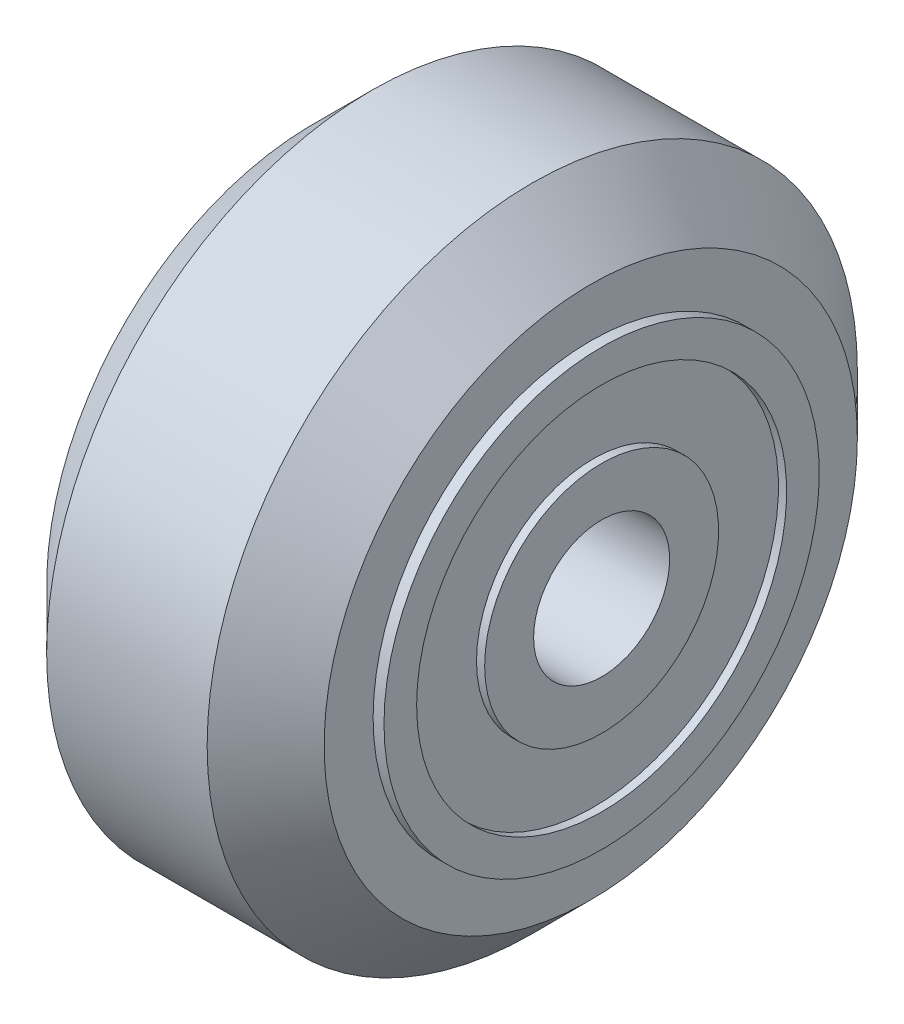
ISO-10303-21;
HEADER;
FILE_DESCRIPTION(('STEP AP214'),'2;1');
FILE_NAME('part.step','',(''),(''),'','','');
FILE_SCHEMA(('AUTOMOTIVE_DESIGN { 1 0 10303 214 1 1 1 1 }'));
ENDSEC;
DATA;
#1=APPLICATION_CONTEXT('core data for automotive mechanical design processes');
#2=APPLICATION_PROTOCOL_DEFINITION('international standard','automotive_design',2000,#1);
#3=PRODUCT_CONTEXT('',#1,'mechanical');
#4=PRODUCT('Part','Part','',(#3));
#5=PRODUCT_RELATED_PRODUCT_CATEGORY('part','',(#4));
#6=PRODUCT_DEFINITION_FORMATION('','',#4);
#7=PRODUCT_DEFINITION_CONTEXT('part definition',#1,'design');
#8=PRODUCT_DEFINITION('design','',#6,#7);
#9=PRODUCT_DEFINITION_SHAPE('','',#8);
#10=(LENGTH_UNIT() NAMED_UNIT(*) SI_UNIT(.MILLI.,.METRE.));
#11=(NAMED_UNIT(*) PLANE_ANGLE_UNIT() SI_UNIT($,.RADIAN.));
#12=(NAMED_UNIT(*) SI_UNIT($,.STERADIAN.) SOLID_ANGLE_UNIT());
#13=UNCERTAINTY_MEASURE_WITH_UNIT(LENGTH_MEASURE(1.E-05),#10,'distance_accuracy_value','');
#14=(GEOMETRIC_REPRESENTATION_CONTEXT(3) GLOBAL_UNCERTAINTY_ASSIGNED_CONTEXT((#13)) GLOBAL_UNIT_ASSIGNED_CONTEXT((#10,
#11,#12)) REPRESENTATION_CONTEXT('',''));
#15=CARTESIAN_POINT('',(0.,0.,0.));
#16=DIRECTION('',(0.,0.,1.));
#17=DIRECTION('',(1.,0.,0.));
#18=AXIS2_PLACEMENT_3D('',#15,#16,#17);
#19=CARTESIAN_POINT('',(5.5,0.,0.));
#20=DIRECTION('',(-1.,0.,0.));
#21=DIRECTION('',(0.,0.,1.));
#22=AXIS2_PLACEMENT_3D('',#19,#20,#21);
#23=PLANE('',#22);
#24=CARTESIAN_POINT('',(5.5,0.,0.));
#25=DIRECTION('',(-1.,0.,0.));
#26=DIRECTION('',(0.,0.,1.));
#27=AXIS2_PLACEMENT_3D('',#24,#25,#26);
#28=CIRCLE('',#27,2.5);
#29=CARTESIAN_POINT('',(5.5,0.,2.5));
#30=VERTEX_POINT('',#29);
#31=EDGE_CURVE('E63',#30,#30,#28,.T.);
#32=ORIENTED_EDGE('',*,*,#31,.T.);
#33=EDGE_LOOP('',(#32));
#34=FACE_BOUND('',#33,.T.);
#35=CARTESIAN_POINT('',(5.5,0.,0.));
#36=DIRECTION('',(-1.,0.,0.));
#37=DIRECTION('',(0.,0.,1.));
#38=AXIS2_PLACEMENT_3D('',#35,#36,#37);
#39=CIRCLE('',#38,4.3);
#40=CARTESIAN_POINT('',(5.5,0.,4.3));
#41=VERTEX_POINT('',#40);
#42=EDGE_CURVE('E91',#41,#41,#39,.T.);
#43=ORIENTED_EDGE('',*,*,#42,.F.);
#44=EDGE_LOOP('',(#43));
#45=FACE_BOUND('',#44,.T.);
#46=ADVANCED_FACE('F34',(#34,#45),#23,.F.);
#47=CARTESIAN_POINT('',(-5.5,0.,0.));
#48=DIRECTION('',(-1.,0.,0.));
#49=DIRECTION('',(0.,0.,1.));
#50=AXIS2_PLACEMENT_3D('',#47,#48,#49);
#51=PLANE('',#50);
#52=CARTESIAN_POINT('',(-5.5,0.,0.));
#53=DIRECTION('',(-1.,0.,0.));
#54=DIRECTION('',(0.,0.,1.));
#55=AXIS2_PLACEMENT_3D('',#52,#53,#54);
#56=CIRCLE('',#55,2.5);
#57=CARTESIAN_POINT('',(-5.5,0.,2.5));
#58=VERTEX_POINT('',#57);
#59=EDGE_CURVE('E69',#58,#58,#56,.T.);
#60=ORIENTED_EDGE('',*,*,#59,.F.);
#61=EDGE_LOOP('',(#60));
#62=FACE_BOUND('',#61,.T.);
#63=CARTESIAN_POINT('',(-5.5,0.,0.));
#64=DIRECTION('',(-1.,0.,0.));
#65=DIRECTION('',(0.,0.,1.));
#66=AXIS2_PLACEMENT_3D('',#63,#64,#65);
#67=CIRCLE('',#66,4.3);
#68=CARTESIAN_POINT('',(-5.5,0.,4.3));
#69=VERTEX_POINT('',#68);
#70=EDGE_CURVE('E79',#69,#69,#67,.T.);
#71=ORIENTED_EDGE('',*,*,#70,.T.);
#72=EDGE_LOOP('',(#71));
#73=FACE_BOUND('',#72,.T.);
#74=ADVANCED_FACE('F107',(#62,#73),#51,.T.);
#75=CARTESIAN_POINT('',(5.5,0.,0.));
#76=DIRECTION('',(-1.,0.,0.));
#77=DIRECTION('',(0.,0.,1.));
#78=AXIS2_PLACEMENT_3D('',#75,#76,#77);
#79=CYLINDRICAL_SURFACE('',#78,8.);
#80=CARTESIAN_POINT('',(5.1,0.,0.));
#81=DIRECTION('',(1.,0.,0.));
#82=DIRECTION('',(0.,0.,-1.));
#83=AXIS2_PLACEMENT_3D('',#80,#81,#82);
#84=CIRCLE('',#83,8.);
#85=CARTESIAN_POINT('',(5.1,0.,-8.));
#86=VERTEX_POINT('',#85);
#87=EDGE_CURVE('E10',#86,#86,#84,.T.);
#88=ORIENTED_EDGE('',*,*,#87,.T.);
#89=EDGE_LOOP('',(#88));
#90=FACE_BOUND('',#89,.T.);
#91=CARTESIAN_POINT('',(5.5,0.,0.));
#92=DIRECTION('',(-1.,0.,0.));
#93=DIRECTION('',(0.,0.,1.));
#94=AXIS2_PLACEMENT_3D('',#91,#92,#93);
#95=CIRCLE('',#94,8.);
#96=CARTESIAN_POINT('',(5.5,0.,8.));
#97=VERTEX_POINT('',#96);
#98=EDGE_CURVE('E60',#97,#97,#95,.T.);
#99=ORIENTED_EDGE('',*,*,#98,.T.);
#100=EDGE_LOOP('',(#99));
#101=FACE_BOUND('',#100,.T.);
#102=ADVANCED_FACE('F114',(#90,#101),#79,.T.);
#103=CARTESIAN_POINT('',(-5.1,0.,0.));
#104=DIRECTION('',(-1.,0.,0.));
#105=DIRECTION('',(0.,0.,1.));
#106=AXIS2_PLACEMENT_3D('',#103,#104,#105);
#107=CIRCLE('',#106,8.);
#108=CARTESIAN_POINT('',(-5.1,0.,8.));
#109=VERTEX_POINT('',#108);
#110=EDGE_CURVE('E57',#109,#109,#107,.T.);
#111=ORIENTED_EDGE('',*,*,#110,.T.);
#112=EDGE_LOOP('',(#111));
#113=FACE_BOUND('',#112,.T.);
#114=CARTESIAN_POINT('',(-5.5,0.,0.));
#115=DIRECTION('',(-1.,0.,0.));
#116=DIRECTION('',(0.,0.,1.));
#117=AXIS2_PLACEMENT_3D('',#114,#115,#116);
#118=CIRCLE('',#117,8.);
#119=CARTESIAN_POINT('',(-5.5,0.,8.));
#120=VERTEX_POINT('',#119);
#121=EDGE_CURVE('E66',#120,#120,#118,.T.);
#122=ORIENTED_EDGE('',*,*,#121,.F.);
#123=EDGE_LOOP('',(#122));
#124=FACE_BOUND('',#123,.T.);
#125=ADVANCED_FACE('F122',(#113,#124),#79,.T.);
#126=CARTESIAN_POINT('',(5.5,0.,0.));
#127=DIRECTION('',(-1.,0.,0.));
#128=DIRECTION('',(0.,0.,1.));
#129=AXIS2_PLACEMENT_3D('',#126,#127,#128);
#130=CIRCLE('',#129,6.8);
#131=CARTESIAN_POINT('',(5.5,0.,6.8));
#132=VERTEX_POINT('',#131);
#133=EDGE_CURVE('E85',#132,#132,#130,.T.);
#134=ORIENTED_EDGE('',*,*,#133,.T.);
#135=EDGE_LOOP('',(#134));
#136=FACE_BOUND('',#135,.T.);
#137=ORIENTED_EDGE('',*,*,#98,.F.);
#138=EDGE_LOOP('',(#137));
#139=FACE_BOUND('',#138,.T.);
#140=ADVANCED_FACE('F110',(#136,#139),#23,.F.);
#141=CARTESIAN_POINT('',(5.5,0.,0.));
#142=DIRECTION('',(-1.,0.,0.));
#143=DIRECTION('',(0.,0.,1.));
#144=AXIS2_PLACEMENT_3D('',#141,#142,#143);
#145=CYLINDRICAL_SURFACE('',#144,2.5);
#146=ORIENTED_EDGE('',*,*,#31,.F.);
#147=EDGE_LOOP('',(#146));
#148=FACE_BOUND('',#147,.T.);
#149=ORIENTED_EDGE('',*,*,#59,.T.);
#150=EDGE_LOOP('',(#149));
#151=FACE_BOUND('',#150,.T.);
#152=ADVANCED_FACE('F121',(#148,#151),#145,.F.);
#153=CARTESIAN_POINT('',(-5.5,0.,0.));
#154=DIRECTION('',(-1.,0.,0.));
#155=DIRECTION('',(0.,0.,1.));
#156=AXIS2_PLACEMENT_3D('',#153,#154,#155);
#157=CIRCLE('',#156,6.8);
#158=CARTESIAN_POINT('',(-5.5,0.,6.8));
#159=VERTEX_POINT('',#158);
#160=EDGE_CURVE('E73',#159,#159,#157,.T.);
#161=ORIENTED_EDGE('',*,*,#160,.F.);
#162=EDGE_LOOP('',(#161));
#163=FACE_BOUND('',#162,.T.);
#164=ORIENTED_EDGE('',*,*,#121,.T.);
#165=EDGE_LOOP('',(#164));
#166=FACE_BOUND('',#165,.T.);
#167=ADVANCED_FACE('F117',(#163,#166),#51,.T.);
#168=CARTESIAN_POINT('',(5.1,8.,0.));
#169=DIRECTION('',(1.,0.,0.));
#170=DIRECTION('',(0.,0.,-1.));
#171=AXIS2_PLACEMENT_3D('',#168,#169,#170);
#172=PLANE('',#171);
#173=CARTESIAN_POINT('',(5.1,0.,0.));
#174=DIRECTION('',(1.,0.,0.));
#175=DIRECTION('',(0.,0.,-1.));
#176=AXIS2_PLACEMENT_3D('',#173,#174,#175);
#177=CIRCLE('',#176,9.80000000000001);
#178=CARTESIAN_POINT('',(5.1,0.,-9.80000000000001));
#179=VERTEX_POINT('',#178);
#180=EDGE_CURVE('E41',#179,#179,#177,.T.);
#181=ORIENTED_EDGE('',*,*,#180,.T.);
#182=EDGE_LOOP('',(#181));
#183=FACE_BOUND('',#182,.T.);
#184=ORIENTED_EDGE('',*,*,#87,.F.);
#185=EDGE_LOOP('',(#184));
#186=FACE_BOUND('',#185,.T.);
#187=ADVANCED_FACE('F36',(#183,#186),#172,.T.);
#188=CARTESIAN_POINT('',(5.1,0.,0.));
#189=DIRECTION('',(-1.,0.,0.));
#190=DIRECTION('',(0.,0.,1.));
#191=AXIS2_PLACEMENT_3D('',#188,#189,#190);
#192=CONICAL_SURFACE('',#191,9.80000000000001,0.785398163397446);
#193=CARTESIAN_POINT('',(2.95,0.,0.));
#194=DIRECTION('',(1.,0.,0.));
#195=DIRECTION('',(0.,0.,-1.));
#196=AXIS2_PLACEMENT_3D('',#193,#194,#195);
#197=CIRCLE('',#196,11.95);
#198=CARTESIAN_POINT('',(2.95,0.,-11.95));
#199=VERTEX_POINT('',#198);
#200=EDGE_CURVE('E45',#199,#199,#197,.T.);
#201=ORIENTED_EDGE('',*,*,#200,.T.);
#202=EDGE_LOOP('',(#201));
#203=FACE_BOUND('',#202,.T.);
#204=ORIENTED_EDGE('',*,*,#180,.F.);
#205=EDGE_LOOP('',(#204));
#206=FACE_BOUND('',#205,.T.);
#207=ADVANCED_FACE('F149',(#203,#206),#192,.T.);
#208=CARTESIAN_POINT('',(0.,0.,0.));
#209=DIRECTION('',(1.,0.,0.));
#210=DIRECTION('',(0.,0.,-1.));
#211=AXIS2_PLACEMENT_3D('',#208,#209,#210);
#212=CYLINDRICAL_SURFACE('',#211,11.95);
#213=CARTESIAN_POINT('',(-2.95,0.,0.));
#214=DIRECTION('',(1.,0.,0.));
#215=DIRECTION('',(0.,0.,-1.));
#216=AXIS2_PLACEMENT_3D('',#213,#214,#215);
#217=CIRCLE('',#216,11.95);
#218=CARTESIAN_POINT('',(-2.95,0.,-11.95));
#219=VERTEX_POINT('',#218);
#220=EDGE_CURVE('E49',#219,#219,#217,.T.);
#221=ORIENTED_EDGE('',*,*,#220,.T.);
#222=EDGE_LOOP('',(#221));
#223=FACE_BOUND('',#222,.T.);
#224=ORIENTED_EDGE('',*,*,#200,.F.);
#225=EDGE_LOOP('',(#224));
#226=FACE_BOUND('',#225,.T.);
#227=ADVANCED_FACE('F146',(#223,#226),#212,.T.);
#228=CARTESIAN_POINT('',(-2.95,0.,0.));
#229=DIRECTION('',(1.,0.,0.));
#230=DIRECTION('',(0.,0.,-1.));
#231=AXIS2_PLACEMENT_3D('',#228,#229,#230);
#232=CONICAL_SURFACE('',#231,11.95,0.785398163397447);
#233=CARTESIAN_POINT('',(-5.1,0.,0.));
#234=DIRECTION('',(1.,0.,0.));
#235=DIRECTION('',(0.,0.,-1.));
#236=AXIS2_PLACEMENT_3D('',#233,#234,#235);
#237=CIRCLE('',#236,9.80000000000001);
#238=CARTESIAN_POINT('',(-5.1,0.,-9.80000000000001));
#239=VERTEX_POINT('',#238);
#240=EDGE_CURVE('E54',#239,#239,#237,.T.);
#241=ORIENTED_EDGE('',*,*,#240,.T.);
#242=EDGE_LOOP('',(#241));
#243=FACE_BOUND('',#242,.T.);
#244=ORIENTED_EDGE('',*,*,#220,.F.);
#245=EDGE_LOOP('',(#244));
#246=FACE_BOUND('',#245,.T.);
#247=ADVANCED_FACE('F142',(#243,#246),#232,.T.);
#248=CARTESIAN_POINT('',(-5.1,8.,0.));
#249=DIRECTION('',(-1.,0.,0.));
#250=DIRECTION('',(0.,0.,1.));
#251=AXIS2_PLACEMENT_3D('',#248,#249,#250);
#252=PLANE('',#251);
#253=ORIENTED_EDGE('',*,*,#110,.F.);
#254=EDGE_LOOP('',(#253));
#255=FACE_BOUND('',#254,.T.);
#256=ORIENTED_EDGE('',*,*,#240,.F.);
#257=EDGE_LOOP('',(#256));
#258=FACE_BOUND('',#257,.T.);
#259=ADVANCED_FACE('F138',(#255,#258),#252,.T.);
#260=CARTESIAN_POINT('',(-5.2,0.,0.));
#261=DIRECTION('',(-1.,0.,0.));
#262=DIRECTION('',(0.,0.,1.));
#263=AXIS2_PLACEMENT_3D('',#260,#261,#262);
#264=CYLINDRICAL_SURFACE('',#263,6.8);
#265=CARTESIAN_POINT('',(-5.2,0.,0.));
#266=DIRECTION('',(-1.,0.,0.));
#267=DIRECTION('',(0.,0.,1.));
#268=AXIS2_PLACEMENT_3D('',#265,#266,#267);
#269=CIRCLE('',#268,6.8);
#270=CARTESIAN_POINT('',(-5.2,0.,6.8));
#271=VERTEX_POINT('',#270);
#272=EDGE_CURVE('E72',#271,#271,#269,.T.);
#273=ORIENTED_EDGE('',*,*,#272,.F.);
#274=EDGE_LOOP('',(#273));
#275=FACE_BOUND('',#274,.T.);
#276=ORIENTED_EDGE('',*,*,#160,.T.);
#277=EDGE_LOOP('',(#276));
#278=FACE_BOUND('',#277,.T.);
#279=ADVANCED_FACE('F141',(#275,#278),#264,.F.);
#280=CARTESIAN_POINT('',(-5.2,0.,0.));
#281=DIRECTION('',(-1.,0.,0.));
#282=DIRECTION('',(0.,0.,1.));
#283=AXIS2_PLACEMENT_3D('',#280,#281,#282);
#284=PLANE('',#283);
#285=CARTESIAN_POINT('',(-5.2,0.,0.));
#286=DIRECTION('',(-1.,0.,0.));
#287=DIRECTION('',(0.,0.,1.));
#288=AXIS2_PLACEMENT_3D('',#285,#286,#287);
#289=CIRCLE('',#288,4.3);
#290=CARTESIAN_POINT('',(-5.2,0.,4.3));
#291=VERTEX_POINT('',#290);
#292=EDGE_CURVE('E76',#291,#291,#289,.T.);
#293=ORIENTED_EDGE('',*,*,#292,.F.);
#294=EDGE_LOOP('',(#293));
#295=FACE_BOUND('',#294,.T.);
#296=ORIENTED_EDGE('',*,*,#272,.T.);
#297=EDGE_LOOP('',(#296));
#298=FACE_BOUND('',#297,.T.);
#299=ADVANCED_FACE('F171',(#295,#298),#284,.T.);
#300=CARTESIAN_POINT('',(-5.2,0.,0.));
#301=DIRECTION('',(-1.,0.,0.));
#302=DIRECTION('',(0.,0.,1.));
#303=AXIS2_PLACEMENT_3D('',#300,#301,#302);
#304=CYLINDRICAL_SURFACE('',#303,4.3);
#305=ORIENTED_EDGE('',*,*,#292,.T.);
#306=EDGE_LOOP('',(#305));
#307=FACE_BOUND('',#306,.T.);
#308=ORIENTED_EDGE('',*,*,#70,.F.);
#309=EDGE_LOOP('',(#308));
#310=FACE_BOUND('',#309,.T.);
#311=ADVANCED_FACE('F175',(#307,#310),#304,.T.);
#312=CARTESIAN_POINT('',(5.2,0.,0.));
#313=DIRECTION('',(1.,0.,0.));
#314=DIRECTION('',(0.,0.,1.));
#315=AXIS2_PLACEMENT_3D('',#312,#313,#314);
#316=PLANE('',#315);
#317=CARTESIAN_POINT('',(5.2,0.,0.));
#318=DIRECTION('',(-1.,0.,0.));
#319=DIRECTION('',(0.,0.,1.));
#320=AXIS2_PLACEMENT_3D('',#317,#318,#319);
#321=CIRCLE('',#320,6.8);
#322=CARTESIAN_POINT('',(5.2,0.,6.8));
#323=VERTEX_POINT('',#322);
#324=EDGE_CURVE('E82',#323,#323,#321,.T.);
#325=ORIENTED_EDGE('',*,*,#324,.F.);
#326=EDGE_LOOP('',(#325));
#327=FACE_BOUND('',#326,.T.);
#328=CARTESIAN_POINT('',(5.2,0.,0.));
#329=DIRECTION('',(-1.,0.,0.));
#330=DIRECTION('',(0.,0.,1.));
#331=AXIS2_PLACEMENT_3D('',#328,#329,#330);
#332=CIRCLE('',#331,4.3);
#333=CARTESIAN_POINT('',(5.2,0.,4.3));
#334=VERTEX_POINT('',#333);
#335=EDGE_CURVE('E88',#334,#334,#332,.T.);
#336=ORIENTED_EDGE('',*,*,#335,.T.);
#337=EDGE_LOOP('',(#336));
#338=FACE_BOUND('',#337,.T.);
#339=ADVANCED_FACE('F97',(#327,#338),#316,.T.);
#340=CARTESIAN_POINT('',(5.2,0.,0.));
#341=DIRECTION('',(1.,0.,0.));
#342=DIRECTION('',(0.,0.,-1.));
#343=AXIS2_PLACEMENT_3D('',#340,#341,#342);
#344=CYLINDRICAL_SURFACE('',#343,6.8);
#345=ORIENTED_EDGE('',*,*,#324,.T.);
#346=EDGE_LOOP('',(#345));
#347=FACE_BOUND('',#346,.T.);
#348=ORIENTED_EDGE('',*,*,#133,.F.);
#349=EDGE_LOOP('',(#348));
#350=FACE_BOUND('',#349,.T.);
#351=ADVANCED_FACE('F102',(#347,#350),#344,.F.);
#352=CARTESIAN_POINT('',(5.2,0.,0.));
#353=DIRECTION('',(1.,0.,0.));
#354=DIRECTION('',(0.,0.,-1.));
#355=AXIS2_PLACEMENT_3D('',#352,#353,#354);
#356=CYLINDRICAL_SURFACE('',#355,4.3);
#357=ORIENTED_EDGE('',*,*,#335,.F.);
#358=EDGE_LOOP('',(#357));
#359=FACE_BOUND('',#358,.T.);
#360=ORIENTED_EDGE('',*,*,#42,.T.);
#361=EDGE_LOOP('',(#360));
#362=FACE_BOUND('',#361,.T.);
#363=ADVANCED_FACE('F99',(#359,#362),#356,.T.);
#364=CLOSED_SHELL('',(#46,#74,#102,#125,#140,#152,#167,#187,#207,#227,#247,#259,#279,#299,#311,
#339,#351,#363));
#365=MANIFOLD_SOLID_BREP('B2',#364);
#366=ADVANCED_BREP_SHAPE_REPRESENTATION('',(#18,#365),#14);
#367=SHAPE_DEFINITION_REPRESENTATION(#9,#366);
ENDSEC;
END-ISO-10303-21;
